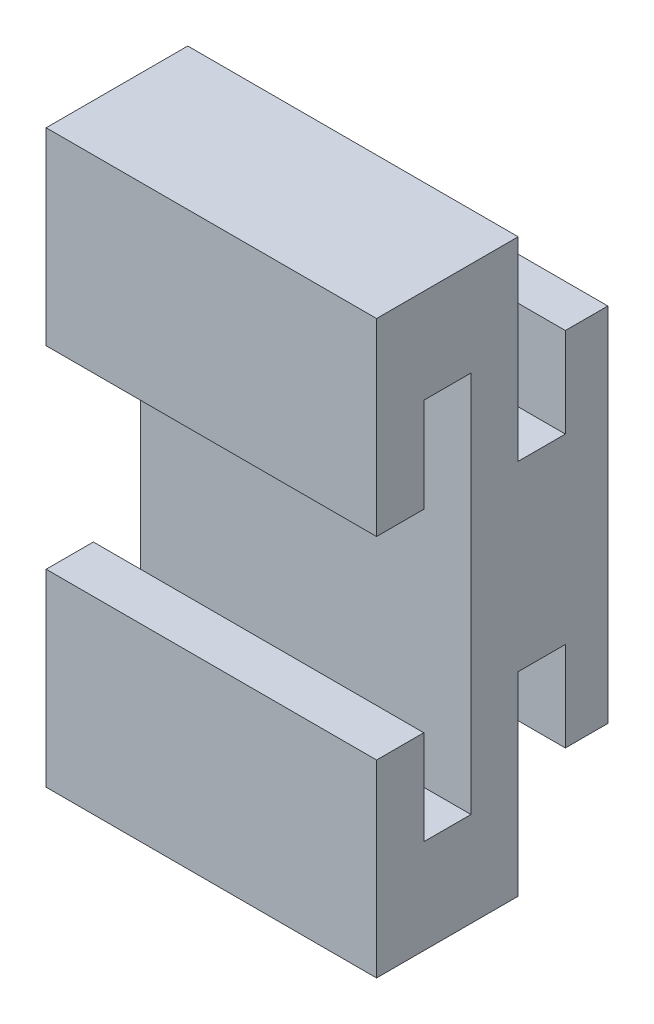
ISO-10303-21;
HEADER;
FILE_DESCRIPTION(('STEP AP214'),'2;1');
FILE_NAME('part.step','',(''),(''),'','','');
FILE_SCHEMA(('AUTOMOTIVE_DESIGN { 1 0 10303 214 1 1 1 1 }'));
ENDSEC;
DATA;
#1=APPLICATION_CONTEXT('core data for automotive mechanical design processes');
#2=APPLICATION_PROTOCOL_DEFINITION('international standard','automotive_design',2000,#1);
#3=PRODUCT_CONTEXT('',#1,'mechanical');
#4=PRODUCT('Part','Part','',(#3));
#5=PRODUCT_RELATED_PRODUCT_CATEGORY('part','',(#4));
#6=PRODUCT_DEFINITION_FORMATION('','',#4);
#7=PRODUCT_DEFINITION_CONTEXT('part definition',#1,'design');
#8=PRODUCT_DEFINITION('design','',#6,#7);
#9=PRODUCT_DEFINITION_SHAPE('','',#8);
#10=(LENGTH_UNIT() NAMED_UNIT(*) SI_UNIT(.MILLI.,.METRE.));
#11=(NAMED_UNIT(*) PLANE_ANGLE_UNIT() SI_UNIT($,.RADIAN.));
#12=(NAMED_UNIT(*) SI_UNIT($,.STERADIAN.) SOLID_ANGLE_UNIT());
#13=UNCERTAINTY_MEASURE_WITH_UNIT(LENGTH_MEASURE(1.E-05),#10,'distance_accuracy_value','');
#14=(GEOMETRIC_REPRESENTATION_CONTEXT(3) GLOBAL_UNCERTAINTY_ASSIGNED_CONTEXT((#13)) GLOBAL_UNIT_ASSIGNED_CONTEXT((#10,
#11,#12)) REPRESENTATION_CONTEXT('',''));
#15=CARTESIAN_POINT('',(0.,0.,0.));
#16=DIRECTION('',(0.,0.,1.));
#17=DIRECTION('',(1.,0.,0.));
#18=AXIS2_PLACEMENT_3D('',#15,#16,#17);
#19=CARTESIAN_POINT('',(8.89,4.9022,-4.826));
#20=DIRECTION('',(0.,-1.,0.));
#21=DIRECTION('',(0.,0.,-1.));
#22=AXIS2_PLACEMENT_3D('',#19,#20,#21);
#23=PLANE('',#22);
#24=DIRECTION('',(1.,0.,0.));
#25=VECTOR('',#24,1.);
#26=CARTESIAN_POINT('',(-8.89,4.9022,-2.54));
#27=LINE('',#26,#25);
#28=CARTESIAN_POINT('',(-8.89,4.9022,-2.54));
#29=VERTEX_POINT('',#28);
#30=CARTESIAN_POINT('',(8.89,4.9022,-2.54));
#31=VERTEX_POINT('',#30);
#32=EDGE_CURVE('E223',#29,#31,#27,.T.);
#33=ORIENTED_EDGE('',*,*,#32,.F.);
#34=DIRECTION('',(0.,0.,1.));
#35=VECTOR('',#34,1.);
#36=CARTESIAN_POINT('',(-8.89,4.9022,-4.826));
#37=LINE('',#36,#35);
#38=CARTESIAN_POINT('',(-8.89,4.9022,0.));
#39=VERTEX_POINT('',#38);
#40=EDGE_CURVE('E255',#29,#39,#37,.T.);
#41=ORIENTED_EDGE('',*,*,#40,.T.);
#42=DIRECTION('',(1.,0.,0.));
#43=VECTOR('',#42,1.);
#44=CARTESIAN_POINT('',(8.89,4.9022,0.));
#45=LINE('',#44,#43);
#46=CARTESIAN_POINT('',(8.89,4.9022,0.));
#47=VERTEX_POINT('',#46);
#48=EDGE_CURVE('E246',#39,#47,#45,.T.);
#49=ORIENTED_EDGE('',*,*,#48,.T.);
#50=DIRECTION('',(0.,0.,1.));
#51=VECTOR('',#50,1.);
#52=CARTESIAN_POINT('',(8.89,4.9022,-4.826));
#53=LINE('',#52,#51);
#54=EDGE_CURVE('E55',#31,#47,#53,.T.);
#55=ORIENTED_EDGE('',*,*,#54,.F.);
#56=EDGE_LOOP('',(#33,#41,#49,#55));
#57=FACE_BOUND('',#56,.T.);
#58=ADVANCED_FACE('F39',(#57),#23,.F.);
#59=CARTESIAN_POINT('',(0.,0.,0.));
#60=DIRECTION('',(0.,0.,1.));
#61=DIRECTION('',(1.,0.,0.));
#62=AXIS2_PLACEMENT_3D('',#59,#60,#61);
#63=PLANE('',#62);
#64=ORIENTED_EDGE('',*,*,#48,.F.);
#65=DIRECTION('',(0.,1.,0.));
#66=VECTOR('',#65,1.);
#67=CARTESIAN_POINT('',(-8.89,-15.367,0.));
#68=LINE('',#67,#66);
#69=CARTESIAN_POINT('',(-8.89,15.367,0.));
#70=VERTEX_POINT('',#69);
#71=EDGE_CURVE('E379',#39,#70,#68,.T.);
#72=ORIENTED_EDGE('',*,*,#71,.T.);
#73=DIRECTION('',(1.,0.,0.));
#74=VECTOR('',#73,1.);
#75=CARTESIAN_POINT('',(-8.89,15.367,0.));
#76=LINE('',#75,#74);
#77=CARTESIAN_POINT('',(8.89,15.367,0.));
#78=VERTEX_POINT('',#77);
#79=EDGE_CURVE('E375',#70,#78,#76,.T.);
#80=ORIENTED_EDGE('',*,*,#79,.T.);
#81=DIRECTION('',(0.,1.,0.));
#82=VECTOR('',#81,1.);
#83=CARTESIAN_POINT('',(8.89,-15.367,0.));
#84=LINE('',#83,#82);
#85=EDGE_CURVE('E370',#47,#78,#84,.T.);
#86=ORIENTED_EDGE('',*,*,#85,.F.);
#87=EDGE_LOOP('',(#64,#72,#80,#86));
#88=FACE_BOUND('',#87,.T.);
#89=ADVANCED_FACE('F397',(#88),#63,.F.);
#90=DIRECTION('',(-1.,0.,0.));
#91=VECTOR('',#90,1.);
#92=CARTESIAN_POINT('',(8.89,-4.9022,0.));
#93=LINE('',#92,#91);
#94=CARTESIAN_POINT('',(8.89,-4.9022,0.));
#95=VERTEX_POINT('',#94);
#96=CARTESIAN_POINT('',(-8.89,-4.9022,0.));
#97=VERTEX_POINT('',#96);
#98=EDGE_CURVE('E244',#95,#97,#93,.T.);
#99=ORIENTED_EDGE('',*,*,#98,.F.);
#100=CARTESIAN_POINT('',(8.89,-15.367,0.));
#101=VERTEX_POINT('',#100);
#102=EDGE_CURVE('E371',#101,#95,#84,.T.);
#103=ORIENTED_EDGE('',*,*,#102,.F.);
#104=DIRECTION('',(1.,0.,0.));
#105=VECTOR('',#104,1.);
#106=CARTESIAN_POINT('',(-8.89,-15.367,0.));
#107=LINE('',#106,#105);
#108=CARTESIAN_POINT('',(-8.89,-15.367,0.));
#109=VERTEX_POINT('',#108);
#110=EDGE_CURVE('E356',#109,#101,#107,.T.);
#111=ORIENTED_EDGE('',*,*,#110,.F.);
#112=EDGE_CURVE('E362',#109,#97,#68,.T.);
#113=ORIENTED_EDGE('',*,*,#112,.T.);
#114=EDGE_LOOP('',(#99,#103,#111,#113));
#115=FACE_BOUND('',#114,.T.);
#116=ADVANCED_FACE('F445',(#115),#63,.F.);
#117=CARTESIAN_POINT('',(-8.89,-10.287,7.62));
#118=DIRECTION('',(0.,-1.,0.));
#119=DIRECTION('',(0.,0.,-1.));
#120=AXIS2_PLACEMENT_3D('',#117,#118,#119);
#121=PLANE('',#120);
#122=DIRECTION('',(-1.,0.,0.));
#123=VECTOR('',#122,1.);
#124=CARTESIAN_POINT('',(-8.89,-10.287,5.08));
#125=LINE('',#124,#123);
#126=CARTESIAN_POINT('',(8.89,-10.287,5.08));
#127=VERTEX_POINT('',#126);
#128=CARTESIAN_POINT('',(-8.89,-10.287,5.08));
#129=VERTEX_POINT('',#128);
#130=EDGE_CURVE('E311',#127,#129,#125,.T.);
#131=ORIENTED_EDGE('',*,*,#130,.F.);
#132=DIRECTION('',(0.,0.,-1.));
#133=VECTOR('',#132,1.);
#134=CARTESIAN_POINT('',(8.89,-10.287,7.62));
#135=LINE('',#134,#133);
#136=CARTESIAN_POINT('',(8.89,-10.287,2.54));
#137=VERTEX_POINT('',#136);
#138=EDGE_CURVE('E353',#127,#137,#135,.T.);
#139=ORIENTED_EDGE('',*,*,#138,.T.);
#140=DIRECTION('',(-1.,0.,0.));
#141=VECTOR('',#140,1.);
#142=CARTESIAN_POINT('',(-8.89,-10.287,2.54));
#143=LINE('',#142,#141);
#144=CARTESIAN_POINT('',(-8.89,-10.287,2.54));
#145=VERTEX_POINT('',#144);
#146=EDGE_CURVE('E335',#137,#145,#143,.T.);
#147=ORIENTED_EDGE('',*,*,#146,.T.);
#148=DIRECTION('',(0.,0.,-1.));
#149=VECTOR('',#148,1.);
#150=CARTESIAN_POINT('',(-8.89,-10.287,7.62));
#151=LINE('',#150,#149);
#152=EDGE_CURVE('E347',#129,#145,#151,.T.);
#153=ORIENTED_EDGE('',*,*,#152,.F.);
#154=EDGE_LOOP('',(#131,#139,#147,#153));
#155=FACE_BOUND('',#154,.T.);
#156=ADVANCED_FACE('F426',(#155),#121,.F.);
#157=CARTESIAN_POINT('',(-8.89,-15.367,2.54));
#158=DIRECTION('',(0.,1.,0.));
#159=DIRECTION('',(0.,0.,1.));
#160=AXIS2_PLACEMENT_3D('',#157,#158,#159);
#161=PLANE('',#160);
#162=ORIENTED_EDGE('',*,*,#110,.T.);
#163=DIRECTION('',(0.,0.,-1.));
#164=VECTOR('',#163,1.);
#165=CARTESIAN_POINT('',(8.89,-15.367,2.54));
#166=LINE('',#165,#164);
#167=CARTESIAN_POINT('',(8.89,-15.367,7.62));
#168=VERTEX_POINT('',#167);
#169=EDGE_CURVE('E11',#168,#101,#166,.T.);
#170=ORIENTED_EDGE('',*,*,#169,.F.);
#171=DIRECTION('',(1.,0.,0.));
#172=VECTOR('',#171,1.);
#173=CARTESIAN_POINT('',(-8.89,-15.367,7.62));
#174=LINE('',#173,#172);
#175=CARTESIAN_POINT('',(-8.89,-15.367,7.62));
#176=VERTEX_POINT('',#175);
#177=EDGE_CURVE('E340',#176,#168,#174,.T.);
#178=ORIENTED_EDGE('',*,*,#177,.F.);
#179=DIRECTION('',(0.,0.,-1.));
#180=VECTOR('',#179,1.);
#181=CARTESIAN_POINT('',(-8.89,-15.367,2.54));
#182=LINE('',#181,#180);
#183=EDGE_CURVE('E366',#176,#109,#182,.T.);
#184=ORIENTED_EDGE('',*,*,#183,.T.);
#185=EDGE_LOOP('',(#162,#170,#178,#184));
#186=FACE_BOUND('',#185,.T.);
#187=ADVANCED_FACE('F41',(#186),#161,.F.);
#188=CARTESIAN_POINT('',(8.89,-15.367,2.54));
#189=DIRECTION('',(-1.,0.,0.));
#190=DIRECTION('',(0.,0.,1.));
#191=AXIS2_PLACEMENT_3D('',#188,#189,#190);
#192=PLANE('',#191);
#193=DIRECTION('',(0.,-1.,0.));
#194=VECTOR('',#193,1.);
#195=CARTESIAN_POINT('',(8.89,9.7282,-2.54));
#196=LINE('',#195,#194);
#197=CARTESIAN_POINT('',(8.89,9.7282,-2.54));
#198=VERTEX_POINT('',#197);
#199=EDGE_CURVE('E236',#198,#31,#196,.T.);
#200=ORIENTED_EDGE('',*,*,#199,.T.);
#201=ORIENTED_EDGE('',*,*,#54,.T.);
#202=ORIENTED_EDGE('',*,*,#85,.T.);
#203=DIRECTION('',(0.,0.,-1.));
#204=VECTOR('',#203,1.);
#205=CARTESIAN_POINT('',(8.89,15.367,2.54));
#206=LINE('',#205,#204);
#207=CARTESIAN_POINT('',(8.89,15.367,7.62));
#208=VERTEX_POINT('',#207);
#209=EDGE_CURVE('E48',#208,#78,#206,.T.);
#210=ORIENTED_EDGE('',*,*,#209,.F.);
#211=DIRECTION('',(0.,-1.,0.));
#212=VECTOR('',#211,1.);
#213=CARTESIAN_POINT('',(8.89,15.367,7.62));
#214=LINE('',#213,#212);
#215=CARTESIAN_POINT('',(8.89,5.207,7.62));
#216=VERTEX_POINT('',#215);
#217=EDGE_CURVE('E295',#208,#216,#214,.T.);
#218=ORIENTED_EDGE('',*,*,#217,.T.);
#219=DIRECTION('',(0.,0.,-1.));
#220=VECTOR('',#219,1.);
#221=CARTESIAN_POINT('',(8.89,5.207,7.62));
#222=LINE('',#221,#220);
#223=CARTESIAN_POINT('',(8.89,5.207,5.08));
#224=VERTEX_POINT('',#223);
#225=EDGE_CURVE('E272',#216,#224,#222,.T.);
#226=ORIENTED_EDGE('',*,*,#225,.T.);
#227=DIRECTION('',(0.,1.,0.));
#228=VECTOR('',#227,1.);
#229=CARTESIAN_POINT('',(8.89,5.207,5.08));
#230=LINE('',#229,#228);
#231=CARTESIAN_POINT('',(8.89,10.287,5.08));
#232=VERTEX_POINT('',#231);
#233=EDGE_CURVE('E280',#224,#232,#230,.T.);
#234=ORIENTED_EDGE('',*,*,#233,.T.);
#235=DIRECTION('',(0.,0.,-1.));
#236=VECTOR('',#235,1.);
#237=CARTESIAN_POINT('',(8.89,10.287,7.62));
#238=LINE('',#237,#236);
#239=CARTESIAN_POINT('',(8.89,10.287,2.54));
#240=VERTEX_POINT('',#239);
#241=EDGE_CURVE('E302',#232,#240,#238,.T.);
#242=ORIENTED_EDGE('',*,*,#241,.T.);
#243=DIRECTION('',(0.,1.,0.));
#244=VECTOR('',#243,1.);
#245=CARTESIAN_POINT('',(8.89,-15.367,2.54));
#246=LINE('',#245,#244);
#247=EDGE_CURVE('E357',#137,#240,#246,.T.);
#248=ORIENTED_EDGE('',*,*,#247,.F.);
#249=ORIENTED_EDGE('',*,*,#138,.F.);
#250=DIRECTION('',(0.,-1.,0.));
#251=VECTOR('',#250,1.);
#252=CARTESIAN_POINT('',(8.89,-5.207,5.08));
#253=LINE('',#252,#251);
#254=CARTESIAN_POINT('',(8.89,-5.207,5.08));
#255=VERTEX_POINT('',#254);
#256=EDGE_CURVE('E332',#255,#127,#253,.T.);
#257=ORIENTED_EDGE('',*,*,#256,.F.);
#258=DIRECTION('',(0.,0.,-1.));
#259=VECTOR('',#258,1.);
#260=CARTESIAN_POINT('',(8.89,-5.207,7.62));
#261=LINE('',#260,#259);
#262=CARTESIAN_POINT('',(8.89,-5.207,7.62));
#263=VERTEX_POINT('',#262);
#264=EDGE_CURVE('E320',#263,#255,#261,.T.);
#265=ORIENTED_EDGE('',*,*,#264,.F.);
#266=DIRECTION('',(0.,1.,0.));
#267=VECTOR('',#266,1.);
#268=CARTESIAN_POINT('',(8.89,-15.367,7.62));
#269=LINE('',#268,#267);
#270=EDGE_CURVE('E344',#168,#263,#269,.T.);
#271=ORIENTED_EDGE('',*,*,#270,.F.);
#272=ORIENTED_EDGE('',*,*,#169,.T.);
#273=ORIENTED_EDGE('',*,*,#102,.T.);
#274=DIRECTION('',(0.,0.,1.));
#275=VECTOR('',#274,1.);
#276=CARTESIAN_POINT('',(8.89,-4.9022,-4.826));
#277=LINE('',#276,#275);
#278=CARTESIAN_POINT('',(8.89,-4.9022,-2.54));
#279=VERTEX_POINT('',#278);
#280=EDGE_CURVE('E63',#279,#95,#277,.T.);
#281=ORIENTED_EDGE('',*,*,#280,.F.);
#282=DIRECTION('',(0.,1.,0.));
#283=VECTOR('',#282,1.);
#284=CARTESIAN_POINT('',(8.89,-9.7282,-2.54));
#285=LINE('',#284,#283);
#286=CARTESIAN_POINT('',(8.89,-9.7282,-2.54));
#287=VERTEX_POINT('',#286);
#288=EDGE_CURVE('E220',#287,#279,#285,.T.);
#289=ORIENTED_EDGE('',*,*,#288,.F.);
#290=DIRECTION('',(0.,0.,-1.));
#291=VECTOR('',#290,1.);
#292=CARTESIAN_POINT('',(8.89,-9.7282,-4.826));
#293=LINE('',#292,#291);
#294=CARTESIAN_POINT('',(8.89,-9.7282,-4.826));
#295=VERTEX_POINT('',#294);
#296=EDGE_CURVE('E208',#287,#295,#293,.T.);
#297=ORIENTED_EDGE('',*,*,#296,.T.);
#298=DIRECTION('',(0.,-1.,0.));
#299=VECTOR('',#298,1.);
#300=CARTESIAN_POINT('',(8.89,4.9022,-4.826));
#301=LINE('',#300,#299);
#302=CARTESIAN_POINT('',(8.89,9.7282,-4.826));
#303=VERTEX_POINT('',#302);
#304=EDGE_CURVE('E193',#303,#295,#301,.T.);
#305=ORIENTED_EDGE('',*,*,#304,.F.);
#306=DIRECTION('',(0.,0.,-1.));
#307=VECTOR('',#306,1.);
#308=CARTESIAN_POINT('',(8.89,9.7282,-4.826));
#309=LINE('',#308,#307);
#310=EDGE_CURVE('E229',#198,#303,#309,.T.);
#311=ORIENTED_EDGE('',*,*,#310,.F.);
#312=EDGE_LOOP('',(#200,#201,#202,#210,#218,#226,#234,#242,#248,#249,#257,#265,#271,#272,#273,
#281,#289,#297,#305,#311));
#313=FACE_BOUND('',#312,.T.);
#314=ADVANCED_FACE('F406',(#313),#192,.F.);
#315=CARTESIAN_POINT('',(-8.89,15.367,2.54));
#316=DIRECTION('',(0.,1.,0.));
#317=DIRECTION('',(0.,0.,1.));
#318=AXIS2_PLACEMENT_3D('',#315,#316,#317);
#319=PLANE('',#318);
#320=ORIENTED_EDGE('',*,*,#79,.F.);
#321=DIRECTION('',(0.,0.,-1.));
#322=VECTOR('',#321,1.);
#323=CARTESIAN_POINT('',(-8.89,15.367,2.54));
#324=LINE('',#323,#322);
#325=CARTESIAN_POINT('',(-8.89,15.367,7.62));
#326=VERTEX_POINT('',#325);
#327=EDGE_CURVE('E385',#326,#70,#324,.T.);
#328=ORIENTED_EDGE('',*,*,#327,.F.);
#329=DIRECTION('',(1.,0.,0.));
#330=VECTOR('',#329,1.);
#331=CARTESIAN_POINT('',(-8.89,15.367,7.62));
#332=LINE('',#331,#330);
#333=EDGE_CURVE('E298',#326,#208,#332,.T.);
#334=ORIENTED_EDGE('',*,*,#333,.T.);
#335=ORIENTED_EDGE('',*,*,#209,.T.);
#336=EDGE_LOOP('',(#320,#328,#334,#335));
#337=FACE_BOUND('',#336,.T.);
#338=ADVANCED_FACE('F392',(#337),#319,.T.);
#339=CARTESIAN_POINT('',(-8.89,-15.367,2.54));
#340=DIRECTION('',(-1.,0.,0.));
#341=DIRECTION('',(0.,0.,1.));
#342=AXIS2_PLACEMENT_3D('',#339,#340,#341);
#343=PLANE('',#342);
#344=DIRECTION('',(0.,0.,1.));
#345=VECTOR('',#344,1.);
#346=CARTESIAN_POINT('',(-8.89,9.7282,-4.826));
#347=LINE('',#346,#345);
#348=CARTESIAN_POINT('',(-8.89,9.7282,-4.826));
#349=VERTEX_POINT('',#348);
#350=CARTESIAN_POINT('',(-8.89,9.7282,-2.54));
#351=VERTEX_POINT('',#350);
#352=EDGE_CURVE('E187',#349,#351,#347,.T.);
#353=ORIENTED_EDGE('',*,*,#352,.F.);
#354=DIRECTION('',(0.,1.,0.));
#355=VECTOR('',#354,1.);
#356=CARTESIAN_POINT('',(-8.89,4.9022,-4.826));
#357=LINE('',#356,#355);
#358=CARTESIAN_POINT('',(-8.89,-9.7282,-4.826));
#359=VERTEX_POINT('',#358);
#360=EDGE_CURVE('E180',#359,#349,#357,.T.);
#361=ORIENTED_EDGE('',*,*,#360,.F.);
#362=DIRECTION('',(0.,0.,1.));
#363=VECTOR('',#362,1.);
#364=CARTESIAN_POINT('',(-8.89,-9.7282,-4.826));
#365=LINE('',#364,#363);
#366=CARTESIAN_POINT('',(-8.89,-9.7282,-2.54));
#367=VERTEX_POINT('',#366);
#368=EDGE_CURVE('E183',#359,#367,#365,.T.);
#369=ORIENTED_EDGE('',*,*,#368,.T.);
#370=DIRECTION('',(0.,1.,0.));
#371=VECTOR('',#370,1.);
#372=CARTESIAN_POINT('',(-8.89,-9.7282,-2.54));
#373=LINE('',#372,#371);
#374=CARTESIAN_POINT('',(-8.89,-4.9022,-2.54));
#375=VERTEX_POINT('',#374);
#376=EDGE_CURVE('E215',#367,#375,#373,.T.);
#377=ORIENTED_EDGE('',*,*,#376,.T.);
#378=DIRECTION('',(0.,0.,1.));
#379=VECTOR('',#378,1.);
#380=CARTESIAN_POINT('',(-8.89,-4.9022,-4.826));
#381=LINE('',#380,#379);
#382=EDGE_CURVE('E258',#375,#97,#381,.T.);
#383=ORIENTED_EDGE('',*,*,#382,.T.);
#384=ORIENTED_EDGE('',*,*,#112,.F.);
#385=ORIENTED_EDGE('',*,*,#183,.F.);
#386=DIRECTION('',(0.,-1.,0.));
#387=VECTOR('',#386,1.);
#388=CARTESIAN_POINT('',(-8.89,-15.367,7.62));
#389=LINE('',#388,#387);
#390=CARTESIAN_POINT('',(-8.89,-5.207,7.62));
#391=VERTEX_POINT('',#390);
#392=EDGE_CURVE('E336',#391,#176,#389,.T.);
#393=ORIENTED_EDGE('',*,*,#392,.F.);
#394=DIRECTION('',(0.,0.,1.));
#395=VECTOR('',#394,1.);
#396=CARTESIAN_POINT('',(-8.89,-5.207,7.62));
#397=LINE('',#396,#395);
#398=CARTESIAN_POINT('',(-8.89,-5.207,5.08));
#399=VERTEX_POINT('',#398);
#400=EDGE_CURVE('E312',#399,#391,#397,.T.);
#401=ORIENTED_EDGE('',*,*,#400,.F.);
#402=DIRECTION('',(0.,-1.,0.));
#403=VECTOR('',#402,1.);
#404=CARTESIAN_POINT('',(-8.89,-5.207,5.08));
#405=LINE('',#404,#403);
#406=EDGE_CURVE('E326',#399,#129,#405,.T.);
#407=ORIENTED_EDGE('',*,*,#406,.T.);
#408=ORIENTED_EDGE('',*,*,#152,.T.);
#409=DIRECTION('',(0.,1.,0.));
#410=VECTOR('',#409,1.);
#411=CARTESIAN_POINT('',(-8.89,-15.367,2.54));
#412=LINE('',#411,#410);
#413=CARTESIAN_POINT('',(-8.89,10.287,2.54));
#414=VERTEX_POINT('',#413);
#415=EDGE_CURVE('E361',#145,#414,#412,.T.);
#416=ORIENTED_EDGE('',*,*,#415,.T.);
#417=DIRECTION('',(0.,0.,-1.));
#418=VECTOR('',#417,1.);
#419=CARTESIAN_POINT('',(-8.89,10.287,7.62));
#420=LINE('',#419,#418);
#421=CARTESIAN_POINT('',(-8.89,10.287,5.08));
#422=VERTEX_POINT('',#421);
#423=EDGE_CURVE('E308',#422,#414,#420,.T.);
#424=ORIENTED_EDGE('',*,*,#423,.F.);
#425=DIRECTION('',(0.,1.,0.));
#426=VECTOR('',#425,1.);
#427=CARTESIAN_POINT('',(-8.89,5.207,5.08));
#428=LINE('',#427,#426);
#429=CARTESIAN_POINT('',(-8.89,5.207,5.08));
#430=VERTEX_POINT('',#429);
#431=EDGE_CURVE('E286',#430,#422,#428,.T.);
#432=ORIENTED_EDGE('',*,*,#431,.F.);
#433=DIRECTION('',(0.,0.,1.));
#434=VECTOR('',#433,1.);
#435=CARTESIAN_POINT('',(-8.89,5.207,7.62));
#436=LINE('',#435,#434);
#437=CARTESIAN_POINT('',(-8.89,5.207,7.62));
#438=VERTEX_POINT('',#437);
#439=EDGE_CURVE('E264',#430,#438,#436,.T.);
#440=ORIENTED_EDGE('',*,*,#439,.T.);
#441=DIRECTION('',(0.,1.,0.));
#442=VECTOR('',#441,1.);
#443=CARTESIAN_POINT('',(-8.89,15.367,7.62));
#444=LINE('',#443,#442);
#445=EDGE_CURVE('E291',#438,#326,#444,.T.);
#446=ORIENTED_EDGE('',*,*,#445,.T.);
#447=ORIENTED_EDGE('',*,*,#327,.T.);
#448=ORIENTED_EDGE('',*,*,#71,.F.);
#449=ORIENTED_EDGE('',*,*,#40,.F.);
#450=DIRECTION('',(0.,-1.,0.));
#451=VECTOR('',#450,1.);
#452=CARTESIAN_POINT('',(-8.89,9.7282,-2.54));
#453=LINE('',#452,#451);
#454=EDGE_CURVE('E241',#351,#29,#453,.T.);
#455=ORIENTED_EDGE('',*,*,#454,.F.);
#456=EDGE_LOOP('',(#353,#361,#369,#377,#383,#384,#385,#393,#401,#407,#408,#416,#424,#432,#440,
#446,#447,#448,#449,#455));
#457=FACE_BOUND('',#456,.T.);
#458=ADVANCED_FACE('F182',(#457),#343,.T.);
#459=CARTESIAN_POINT('',(0.,0.,2.54));
#460=DIRECTION('',(0.,0.,1.));
#461=DIRECTION('',(1.,0.,0.));
#462=AXIS2_PLACEMENT_3D('',#459,#460,#461);
#463=PLANE('',#462);
#464=DIRECTION('',(-1.,0.,0.));
#465=VECTOR('',#464,1.);
#466=CARTESIAN_POINT('',(-8.89,10.287,2.54));
#467=LINE('',#466,#465);
#468=EDGE_CURVE('E290',#240,#414,#467,.T.);
#469=ORIENTED_EDGE('',*,*,#468,.T.);
#470=ORIENTED_EDGE('',*,*,#415,.F.);
#471=ORIENTED_EDGE('',*,*,#146,.F.);
#472=ORIENTED_EDGE('',*,*,#247,.T.);
#473=EDGE_LOOP('',(#469,#470,#471,#472));
#474=FACE_BOUND('',#473,.T.);
#475=ADVANCED_FACE('F422',(#474),#463,.T.);
#476=CARTESIAN_POINT('',(0.,0.,7.62));
#477=DIRECTION('',(0.,0.,-1.));
#478=DIRECTION('',(-1.,0.,0.));
#479=AXIS2_PLACEMENT_3D('',#476,#477,#478);
#480=PLANE('',#479);
#481=ORIENTED_EDGE('',*,*,#392,.T.);
#482=ORIENTED_EDGE('',*,*,#177,.T.);
#483=ORIENTED_EDGE('',*,*,#270,.T.);
#484=DIRECTION('',(1.,0.,0.));
#485=VECTOR('',#484,1.);
#486=CARTESIAN_POINT('',(-8.89,-5.207,7.62));
#487=LINE('',#486,#485);
#488=EDGE_CURVE('E316',#391,#263,#487,.T.);
#489=ORIENTED_EDGE('',*,*,#488,.F.);
#490=EDGE_LOOP('',(#481,#482,#483,#489));
#491=FACE_BOUND('',#490,.T.);
#492=ADVANCED_FACE('F439',(#491),#480,.F.);
#493=CARTESIAN_POINT('',(-8.89,-5.207,5.08));
#494=DIRECTION('',(0.,0.,1.));
#495=DIRECTION('',(1.,0.,0.));
#496=AXIS2_PLACEMENT_3D('',#493,#494,#495);
#497=PLANE('',#496);
#498=ORIENTED_EDGE('',*,*,#130,.T.);
#499=ORIENTED_EDGE('',*,*,#406,.F.);
#500=DIRECTION('',(-1.,0.,0.));
#501=VECTOR('',#500,1.);
#502=CARTESIAN_POINT('',(-8.89,-5.207,5.08));
#503=LINE('',#502,#501);
#504=EDGE_CURVE('E323',#255,#399,#503,.T.);
#505=ORIENTED_EDGE('',*,*,#504,.F.);
#506=ORIENTED_EDGE('',*,*,#256,.T.);
#507=EDGE_LOOP('',(#498,#499,#505,#506));
#508=FACE_BOUND('',#507,.T.);
#509=ADVANCED_FACE('F433',(#508),#497,.F.);
#510=CARTESIAN_POINT('',(0.,-5.207,0.));
#511=DIRECTION('',(0.,-1.,0.));
#512=DIRECTION('',(0.,0.,-1.));
#513=AXIS2_PLACEMENT_3D('',#510,#511,#512);
#514=PLANE('',#513);
#515=ORIENTED_EDGE('',*,*,#400,.T.);
#516=ORIENTED_EDGE('',*,*,#488,.T.);
#517=ORIENTED_EDGE('',*,*,#264,.T.);
#518=ORIENTED_EDGE('',*,*,#504,.T.);
#519=EDGE_LOOP('',(#515,#516,#517,#518));
#520=FACE_BOUND('',#519,.T.);
#521=ADVANCED_FACE('F436',(#520),#514,.F.);
#522=CARTESIAN_POINT('',(-8.89,10.287,7.62));
#523=DIRECTION('',(0.,-1.,0.));
#524=DIRECTION('',(0.,0.,-1.));
#525=AXIS2_PLACEMENT_3D('',#522,#523,#524);
#526=PLANE('',#525);
#527=DIRECTION('',(-1.,0.,0.));
#528=VECTOR('',#527,1.);
#529=CARTESIAN_POINT('',(-8.89,10.287,5.08));
#530=LINE('',#529,#528);
#531=EDGE_CURVE('E263',#232,#422,#530,.T.);
#532=ORIENTED_EDGE('',*,*,#531,.T.);
#533=ORIENTED_EDGE('',*,*,#423,.T.);
#534=ORIENTED_EDGE('',*,*,#468,.F.);
#535=ORIENTED_EDGE('',*,*,#241,.F.);
#536=EDGE_LOOP('',(#532,#533,#534,#535));
#537=FACE_BOUND('',#536,.T.);
#538=ADVANCED_FACE('F417',(#537),#526,.T.);
#539=CARTESIAN_POINT('',(0.,0.,7.62));
#540=DIRECTION('',(0.,0.,-1.));
#541=DIRECTION('',(-1.,0.,0.));
#542=AXIS2_PLACEMENT_3D('',#539,#540,#541);
#543=PLANE('',#542);
#544=ORIENTED_EDGE('',*,*,#445,.F.);
#545=DIRECTION('',(1.,0.,0.));
#546=VECTOR('',#545,1.);
#547=CARTESIAN_POINT('',(-8.89,5.207,7.62));
#548=LINE('',#547,#546);
#549=EDGE_CURVE('E276',#438,#216,#548,.T.);
#550=ORIENTED_EDGE('',*,*,#549,.T.);
#551=ORIENTED_EDGE('',*,*,#217,.F.);
#552=ORIENTED_EDGE('',*,*,#333,.F.);
#553=EDGE_LOOP('',(#544,#550,#551,#552));
#554=FACE_BOUND('',#553,.T.);
#555=ADVANCED_FACE('F404',(#554),#543,.F.);
#556=CARTESIAN_POINT('',(-8.89,5.207,5.08));
#557=DIRECTION('',(0.,0.,-1.));
#558=DIRECTION('',(-1.,0.,0.));
#559=AXIS2_PLACEMENT_3D('',#556,#557,#558);
#560=PLANE('',#559);
#561=ORIENTED_EDGE('',*,*,#531,.F.);
#562=ORIENTED_EDGE('',*,*,#233,.F.);
#563=DIRECTION('',(-1.,0.,0.));
#564=VECTOR('',#563,1.);
#565=CARTESIAN_POINT('',(-8.89,5.207,5.08));
#566=LINE('',#565,#564);
#567=EDGE_CURVE('E268',#224,#430,#566,.T.);
#568=ORIENTED_EDGE('',*,*,#567,.T.);
#569=ORIENTED_EDGE('',*,*,#431,.T.);
#570=EDGE_LOOP('',(#561,#562,#568,#569));
#571=FACE_BOUND('',#570,.T.);
#572=ADVANCED_FACE('F412',(#571),#560,.T.);
#573=CARTESIAN_POINT('',(0.,5.207,0.));
#574=DIRECTION('',(0.,1.,0.));
#575=DIRECTION('',(0.,0.,-1.));
#576=AXIS2_PLACEMENT_3D('',#573,#574,#575);
#577=PLANE('',#576);
#578=ORIENTED_EDGE('',*,*,#439,.F.);
#579=ORIENTED_EDGE('',*,*,#567,.F.);
#580=ORIENTED_EDGE('',*,*,#225,.F.);
#581=ORIENTED_EDGE('',*,*,#549,.F.);
#582=EDGE_LOOP('',(#578,#579,#580,#581));
#583=FACE_BOUND('',#582,.T.);
#584=ADVANCED_FACE('F409',(#583),#577,.F.);
#585=CARTESIAN_POINT('',(8.89,-4.9022,-4.826));
#586=DIRECTION('',(0.,1.,0.));
#587=DIRECTION('',(0.,0.,1.));
#588=AXIS2_PLACEMENT_3D('',#585,#586,#587);
#589=PLANE('',#588);
#590=ORIENTED_EDGE('',*,*,#382,.F.);
#591=DIRECTION('',(1.,0.,0.));
#592=VECTOR('',#591,1.);
#593=CARTESIAN_POINT('',(-8.89,-4.9022,-2.54));
#594=LINE('',#593,#592);
#595=EDGE_CURVE('E204',#375,#279,#594,.T.);
#596=ORIENTED_EDGE('',*,*,#595,.T.);
#597=ORIENTED_EDGE('',*,*,#280,.T.);
#598=ORIENTED_EDGE('',*,*,#98,.T.);
#599=EDGE_LOOP('',(#590,#596,#597,#598));
#600=FACE_BOUND('',#599,.T.);
#601=ADVANCED_FACE('F448',(#600),#589,.F.);
#602=CARTESIAN_POINT('',(0.,0.,-4.826));
#603=DIRECTION('',(0.,0.,-1.));
#604=DIRECTION('',(-1.,0.,0.));
#605=AXIS2_PLACEMENT_3D('',#602,#603,#604);
#606=PLANE('',#605);
#607=ORIENTED_EDGE('',*,*,#304,.T.);
#608=DIRECTION('',(-1.,0.,0.));
#609=VECTOR('',#608,1.);
#610=CARTESIAN_POINT('',(-8.89,-9.7282,-4.826));
#611=LINE('',#610,#609);
#612=EDGE_CURVE('E199',#295,#359,#611,.T.);
#613=ORIENTED_EDGE('',*,*,#612,.T.);
#614=ORIENTED_EDGE('',*,*,#360,.T.);
#615=DIRECTION('',(-1.,0.,0.));
#616=VECTOR('',#615,1.);
#617=CARTESIAN_POINT('',(-8.89,9.7282,-4.826));
#618=LINE('',#617,#616);
#619=EDGE_CURVE('E233',#303,#349,#618,.T.);
#620=ORIENTED_EDGE('',*,*,#619,.F.);
#621=EDGE_LOOP('',(#607,#613,#614,#620));
#622=FACE_BOUND('',#621,.T.);
#623=ADVANCED_FACE('F206',(#622),#606,.T.);
#624=CARTESIAN_POINT('',(-8.89,9.7282,-2.54));
#625=DIRECTION('',(0.,0.,-1.));
#626=DIRECTION('',(-1.,0.,0.));
#627=AXIS2_PLACEMENT_3D('',#624,#625,#626);
#628=PLANE('',#627);
#629=ORIENTED_EDGE('',*,*,#32,.T.);
#630=ORIENTED_EDGE('',*,*,#199,.F.);
#631=DIRECTION('',(1.,0.,0.));
#632=VECTOR('',#631,1.);
#633=CARTESIAN_POINT('',(-8.89,9.7282,-2.54));
#634=LINE('',#633,#632);
#635=EDGE_CURVE('E226',#351,#198,#634,.T.);
#636=ORIENTED_EDGE('',*,*,#635,.F.);
#637=ORIENTED_EDGE('',*,*,#454,.T.);
#638=EDGE_LOOP('',(#629,#630,#636,#637));
#639=FACE_BOUND('',#638,.T.);
#640=ADVANCED_FACE('F459',(#639),#628,.F.);
#641=CARTESIAN_POINT('',(0.,9.7282,0.));
#642=DIRECTION('',(0.,1.,0.));
#643=DIRECTION('',(0.,0.,1.));
#644=AXIS2_PLACEMENT_3D('',#641,#642,#643);
#645=PLANE('',#644);
#646=ORIENTED_EDGE('',*,*,#352,.T.);
#647=ORIENTED_EDGE('',*,*,#635,.T.);
#648=ORIENTED_EDGE('',*,*,#310,.T.);
#649=ORIENTED_EDGE('',*,*,#619,.T.);
#650=EDGE_LOOP('',(#646,#647,#648,#649));
#651=FACE_BOUND('',#650,.T.);
#652=ADVANCED_FACE('F452',(#651),#645,.T.);
#653=CARTESIAN_POINT('',(-8.89,-9.7282,-2.54));
#654=DIRECTION('',(0.,0.,1.));
#655=DIRECTION('',(1.,0.,0.));
#656=AXIS2_PLACEMENT_3D('',#653,#654,#655);
#657=PLANE('',#656);
#658=ORIENTED_EDGE('',*,*,#595,.F.);
#659=ORIENTED_EDGE('',*,*,#376,.F.);
#660=DIRECTION('',(1.,0.,0.));
#661=VECTOR('',#660,1.);
#662=CARTESIAN_POINT('',(-8.89,-9.7282,-2.54));
#663=LINE('',#662,#661);
#664=EDGE_CURVE('E202',#367,#287,#663,.T.);
#665=ORIENTED_EDGE('',*,*,#664,.T.);
#666=ORIENTED_EDGE('',*,*,#288,.T.);
#667=EDGE_LOOP('',(#658,#659,#665,#666));
#668=FACE_BOUND('',#667,.T.);
#669=ADVANCED_FACE('F450',(#668),#657,.T.);
#670=CARTESIAN_POINT('',(0.,-9.7282,0.));
#671=DIRECTION('',(0.,-1.,0.));
#672=DIRECTION('',(0.,0.,1.));
#673=AXIS2_PLACEMENT_3D('',#670,#671,#672);
#674=PLANE('',#673);
#675=ORIENTED_EDGE('',*,*,#368,.F.);
#676=ORIENTED_EDGE('',*,*,#612,.F.);
#677=ORIENTED_EDGE('',*,*,#296,.F.);
#678=ORIENTED_EDGE('',*,*,#664,.F.);
#679=EDGE_LOOP('',(#675,#676,#677,#678));
#680=FACE_BOUND('',#679,.T.);
#681=ADVANCED_FACE('F197',(#680),#674,.T.);
#682=CLOSED_SHELL('',(#58,#89,#116,#156,#187,#314,#338,#458,#475,#492,#509,#521,#538,#555,#572,
#584,#601,#623,#640,#652,#669,#681));
#683=MANIFOLD_SOLID_BREP('B2',#682);
#684=ADVANCED_BREP_SHAPE_REPRESENTATION('',(#18,#683),#14);
#685=SHAPE_DEFINITION_REPRESENTATION(#9,#684);
ENDSEC;
END-ISO-10303-21;
